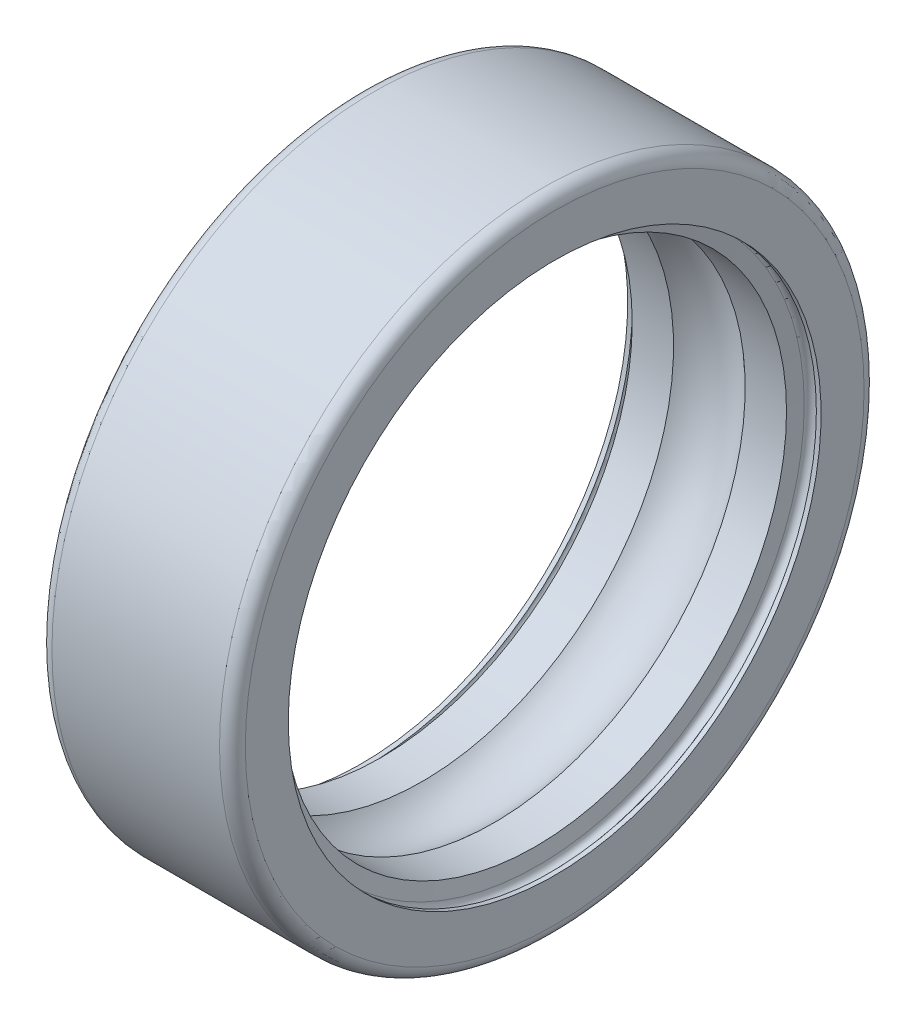
ISO-10303-21;
HEADER;
FILE_DESCRIPTION(('STEP AP214'),'2;1');
FILE_NAME('part.step','',(''),(''),'','','');
FILE_SCHEMA(('AUTOMOTIVE_DESIGN { 1 0 10303 214 1 1 1 1 }'));
ENDSEC;
DATA;
#1=APPLICATION_CONTEXT('core data for automotive mechanical design processes');
#2=APPLICATION_PROTOCOL_DEFINITION('international standard','automotive_design',2000,#1);
#3=PRODUCT_CONTEXT('',#1,'mechanical');
#4=PRODUCT('Part','Part','',(#3));
#5=PRODUCT_RELATED_PRODUCT_CATEGORY('part','',(#4));
#6=PRODUCT_DEFINITION_FORMATION('','',#4);
#7=PRODUCT_DEFINITION_CONTEXT('part definition',#1,'design');
#8=PRODUCT_DEFINITION('design','',#6,#7);
#9=PRODUCT_DEFINITION_SHAPE('','',#8);
#10=(LENGTH_UNIT() NAMED_UNIT(*) SI_UNIT(.MILLI.,.METRE.));
#11=(NAMED_UNIT(*) PLANE_ANGLE_UNIT() SI_UNIT($,.RADIAN.));
#12=(NAMED_UNIT(*) SI_UNIT($,.STERADIAN.) SOLID_ANGLE_UNIT());
#13=UNCERTAINTY_MEASURE_WITH_UNIT(LENGTH_MEASURE(1.E-05),#10,'distance_accuracy_value','');
#14=(GEOMETRIC_REPRESENTATION_CONTEXT(3) GLOBAL_UNCERTAINTY_ASSIGNED_CONTEXT((#13)) GLOBAL_UNIT_ASSIGNED_CONTEXT((#10,
#11,#12)) REPRESENTATION_CONTEXT('',''));
#15=CARTESIAN_POINT('',(0.,0.,0.));
#16=DIRECTION('',(0.,0.,1.));
#17=DIRECTION('',(1.,0.,0.));
#18=AXIS2_PLACEMENT_3D('',#15,#16,#17);
#19=CARTESIAN_POINT('',(4.5,0.,0.));
#20=DIRECTION('',(1.,0.,0.));
#21=DIRECTION('',(0.,0.,-1.));
#22=AXIS2_PLACEMENT_3D('',#19,#20,#21);
#23=TOROIDAL_SURFACE('',#22,10.,2.381);
#24=CARTESIAN_POINT('',(6.16708158168699,0.,0.));
#25=DIRECTION('',(-1.,0.,0.));
#26=DIRECTION('',(0.,0.,1.));
#27=AXIS2_PLACEMENT_3D('',#24,#25,#26);
#28=CIRCLE('',#27,11.7);
#29=CARTESIAN_POINT('',(6.16708158168699,0.,11.7));
#30=VERTEX_POINT('',#29);
#31=EDGE_CURVE('E124',#30,#30,#28,.F.);
#32=ORIENTED_EDGE('',*,*,#31,.T.);
#33=EDGE_LOOP('',(#32));
#34=FACE_BOUND('',#33,.T.);
#35=CARTESIAN_POINT('',(2.83291841831301,0.,0.));
#36=DIRECTION('',(-1.,0.,0.));
#37=DIRECTION('',(0.,0.,1.));
#38=AXIS2_PLACEMENT_3D('',#35,#36,#37);
#39=CIRCLE('',#38,11.7);
#40=CARTESIAN_POINT('',(2.83291841831301,0.,11.7));
#41=VERTEX_POINT('',#40);
#42=EDGE_CURVE('E129',#41,#41,#39,.T.);
#43=ORIENTED_EDGE('',*,*,#42,.T.);
#44=EDGE_LOOP('',(#43));
#45=FACE_BOUND('',#44,.T.);
#46=ADVANCED_FACE('F15',(#34,#45),#23,.F.);
#47=CARTESIAN_POINT('',(8.4,0.,0.));
#48=DIRECTION('',(-1.,0.,0.));
#49=DIRECTION('',(0.,0.,1.));
#50=AXIS2_PLACEMENT_3D('',#47,#48,#49);
#51=CYLINDRICAL_SURFACE('',#50,11.7);
#52=CARTESIAN_POINT('',(0.909428886495922,0.,0.));
#53=DIRECTION('',(-1.,0.,0.));
#54=DIRECTION('',(0.,0.,1.));
#55=AXIS2_PLACEMENT_3D('',#52,#53,#54);
#56=CIRCLE('',#55,11.7);
#57=CARTESIAN_POINT('',(0.909428886495922,0.,11.7));
#58=VERTEX_POINT('',#57);
#59=EDGE_CURVE('E119',#58,#58,#56,.T.);
#60=ORIENTED_EDGE('',*,*,#59,.T.);
#61=EDGE_LOOP('',(#60));
#62=FACE_BOUND('',#61,.T.);
#63=ORIENTED_EDGE('',*,*,#42,.F.);
#64=EDGE_LOOP('',(#63));
#65=FACE_BOUND('',#64,.T.);
#66=ADVANCED_FACE('F243',(#62,#65),#51,.F.);
#67=CARTESIAN_POINT('',(8.4,0.,0.));
#68=DIRECTION('',(-1.,0.,0.));
#69=DIRECTION('',(0.,0.,1.));
#70=AXIS2_PLACEMENT_3D('',#67,#68,#69);
#71=CYLINDRICAL_SURFACE('',#70,11.7);
#72=ORIENTED_EDGE('',*,*,#31,.F.);
#73=EDGE_LOOP('',(#72));
#74=FACE_BOUND('',#73,.T.);
#75=CARTESIAN_POINT('',(8.09057111350408,0.,0.));
#76=DIRECTION('',(1.,0.,0.));
#77=DIRECTION('',(0.,0.,-1.));
#78=AXIS2_PLACEMENT_3D('',#75,#76,#77);
#79=CIRCLE('',#78,11.7);
#80=CARTESIAN_POINT('',(8.09057111350408,0.,-11.7));
#81=VERTEX_POINT('',#80);
#82=EDGE_CURVE('E114',#81,#81,#79,.T.);
#83=ORIENTED_EDGE('',*,*,#82,.T.);
#84=EDGE_LOOP('',(#83));
#85=FACE_BOUND('',#84,.T.);
#86=ADVANCED_FACE('F233',(#74,#85),#71,.F.);
#87=CARTESIAN_POINT('',(0.786000000000001,0.,0.));
#88=DIRECTION('',(-1.,0.,0.));
#89=DIRECTION('',(0.,-1.,0.));
#90=AXIS2_PLACEMENT_3D('',#87,#88,#89);
#91=CONICAL_SURFACE('',#90,12.4,1.39626340159547);
#92=CARTESIAN_POINT('',(0.786000000000001,0.,0.));
#93=DIRECTION('',(1.,0.,0.));
#94=DIRECTION('',(0.,0.,-1.));
#95=AXIS2_PLACEMENT_3D('',#92,#93,#94);
#96=CIRCLE('',#95,12.4);
#97=CARTESIAN_POINT('',(0.786000000000001,0.,-12.4));
#98=VERTEX_POINT('',#97);
#99=EDGE_CURVE('E108',#98,#98,#96,.F.);
#100=ORIENTED_EDGE('',*,*,#99,.T.);
#101=EDGE_LOOP('',(#100));
#102=FACE_BOUND('',#101,.T.);
#103=ORIENTED_EDGE('',*,*,#59,.F.);
#104=EDGE_LOOP('',(#103));
#105=FACE_BOUND('',#104,.T.);
#106=ADVANCED_FACE('F167',(#102,#105),#91,.F.);
#107=CARTESIAN_POINT('',(8.21400000000001,0.,0.));
#108=DIRECTION('',(1.,0.,0.));
#109=DIRECTION('',(0.,0.,-1.));
#110=AXIS2_PLACEMENT_3D('',#107,#108,#109);
#111=CONICAL_SURFACE('',#110,12.4,1.39626340159546);
#112=ORIENTED_EDGE('',*,*,#82,.F.);
#113=EDGE_LOOP('',(#112));
#114=FACE_BOUND('',#113,.T.);
#115=CARTESIAN_POINT('',(8.214,0.,0.));
#116=DIRECTION('',(1.,0.,0.));
#117=DIRECTION('',(0.,0.,-1.));
#118=AXIS2_PLACEMENT_3D('',#115,#116,#117);
#119=CIRCLE('',#118,12.4);
#120=CARTESIAN_POINT('',(8.214,0.,-12.4));
#121=VERTEX_POINT('',#120);
#122=EDGE_CURVE('E104',#121,#121,#119,.T.);
#123=ORIENTED_EDGE('',*,*,#122,.T.);
#124=EDGE_LOOP('',(#123));
#125=FACE_BOUND('',#124,.T.);
#126=ADVANCED_FACE('F161',(#114,#125),#111,.F.);
#127=CARTESIAN_POINT('',(0.503000000000001,0.,0.));
#128=DIRECTION('',(1.,0.,0.));
#129=DIRECTION('',(0.,0.,-1.));
#130=AXIS2_PLACEMENT_3D('',#127,#128,#129);
#131=TOROIDAL_SURFACE('',#130,12.4,0.283);
#132=ORIENTED_EDGE('',*,*,#99,.F.);
#133=EDGE_LOOP('',(#132));
#134=FACE_BOUND('',#133,.T.);
#135=CARTESIAN_POINT('',(0.22,0.,0.));
#136=DIRECTION('',(-1.,0.,0.));
#137=DIRECTION('',(0.,0.,1.));
#138=AXIS2_PLACEMENT_3D('',#135,#136,#137);
#139=CIRCLE('',#138,12.4);
#140=CARTESIAN_POINT('',(0.22,0.,12.4));
#141=VERTEX_POINT('',#140);
#142=EDGE_CURVE('E107',#141,#141,#139,.T.);
#143=ORIENTED_EDGE('',*,*,#142,.T.);
#144=EDGE_LOOP('',(#143));
#145=FACE_BOUND('',#144,.T.);
#146=ADVANCED_FACE('F95',(#134,#145),#131,.F.);
#147=CARTESIAN_POINT('',(8.497,0.,0.));
#148=DIRECTION('',(1.,0.,0.));
#149=DIRECTION('',(0.,0.,-1.));
#150=AXIS2_PLACEMENT_3D('',#147,#148,#149);
#151=TOROIDAL_SURFACE('',#150,12.40000001666,0.282999999999999);
#152=CARTESIAN_POINT('',(8.7799999999996,0.,0.));
#153=DIRECTION('',(-1.,0.,0.));
#154=DIRECTION('',(0.,0.,1.));
#155=AXIS2_PLACEMENT_3D('',#152,#153,#154);
#156=CIRCLE('',#155,12.40000024686);
#157=CARTESIAN_POINT('',(8.7799999999996,0.,12.40000024686));
#158=VERTEX_POINT('',#157);
#159=EDGE_CURVE('E141',#158,#158,#156,.F.);
#160=ORIENTED_EDGE('',*,*,#159,.T.);
#161=EDGE_LOOP('',(#160));
#162=FACE_BOUND('',#161,.T.);
#163=ORIENTED_EDGE('',*,*,#122,.F.);
#164=EDGE_LOOP('',(#163));
#165=FACE_BOUND('',#164,.T.);
#166=ADVANCED_FACE('F90',(#162,#165),#151,.F.);
#167=CARTESIAN_POINT('',(8.4,0.,0.));
#168=DIRECTION('',(-1.,0.,0.));
#169=DIRECTION('',(0.,0.,1.));
#170=AXIS2_PLACEMENT_3D('',#167,#168,#169);
#171=CYLINDRICAL_SURFACE('',#170,12.4);
#172=CARTESIAN_POINT('',(0.,0.,0.));
#173=DIRECTION('',(-1.,0.,0.));
#174=DIRECTION('',(0.,0.,1.));
#175=AXIS2_PLACEMENT_3D('',#172,#173,#174);
#176=CIRCLE('',#175,12.4);
#177=CARTESIAN_POINT('',(0.,0.,12.4));
#178=VERTEX_POINT('',#177);
#179=EDGE_CURVE('E19',#178,#178,#176,.F.);
#180=ORIENTED_EDGE('',*,*,#179,.F.);
#181=EDGE_LOOP('',(#180));
#182=FACE_BOUND('',#181,.T.);
#183=ORIENTED_EDGE('',*,*,#142,.F.);
#184=EDGE_LOOP('',(#183));
#185=FACE_BOUND('',#184,.T.);
#186=ADVANCED_FACE('F86',(#182,#185),#171,.F.);
#187=CARTESIAN_POINT('',(8.4,0.,0.));
#188=DIRECTION('',(-1.,0.,0.));
#189=DIRECTION('',(0.,0.,1.));
#190=AXIS2_PLACEMENT_3D('',#187,#188,#189);
#191=CYLINDRICAL_SURFACE('',#190,12.40000024686);
#192=ORIENTED_EDGE('',*,*,#159,.F.);
#193=EDGE_LOOP('',(#192));
#194=FACE_BOUND('',#193,.T.);
#195=CARTESIAN_POINT('',(9.,0.,0.));
#196=DIRECTION('',(-1.,0.,0.));
#197=DIRECTION('',(0.,0.,1.));
#198=AXIS2_PLACEMENT_3D('',#195,#196,#197);
#199=CIRCLE('',#198,12.40000024686);
#200=CARTESIAN_POINT('',(9.,0.,12.40000024686));
#201=VERTEX_POINT('',#200);
#202=EDGE_CURVE('E136',#201,#201,#199,.T.);
#203=ORIENTED_EDGE('',*,*,#202,.F.);
#204=EDGE_LOOP('',(#203));
#205=FACE_BOUND('',#204,.T.);
#206=ADVANCED_FACE('F82',(#194,#205),#191,.F.);
#207=CARTESIAN_POINT('',(0.,14.4,0.));
#208=DIRECTION('',(-1.,0.,0.));
#209=DIRECTION('',(0.,0.,1.));
#210=AXIS2_PLACEMENT_3D('',#207,#208,#209);
#211=PLANE('',#210);
#212=CARTESIAN_POINT('',(0.,0.,0.));
#213=DIRECTION('',(1.,0.,0.));
#214=DIRECTION('',(0.,0.,-1.));
#215=AXIS2_PLACEMENT_3D('',#212,#213,#214);
#216=CIRCLE('',#215,14.4);
#217=CARTESIAN_POINT('',(0.,0.,-14.4));
#218=VERTEX_POINT('',#217);
#219=EDGE_CURVE('E66',#218,#218,#216,.T.);
#220=ORIENTED_EDGE('',*,*,#219,.F.);
#221=EDGE_LOOP('',(#220));
#222=FACE_BOUND('',#221,.T.);
#223=ORIENTED_EDGE('',*,*,#179,.T.);
#224=EDGE_LOOP('',(#223));
#225=FACE_BOUND('',#224,.T.);
#226=ADVANCED_FACE('F72',(#222,#225),#211,.T.);
#227=CARTESIAN_POINT('',(9.,12.4,0.));
#228=DIRECTION('',(1.,0.,0.));
#229=DIRECTION('',(0.,0.,-1.));
#230=AXIS2_PLACEMENT_3D('',#227,#228,#229);
#231=PLANE('',#230);
#232=ORIENTED_EDGE('',*,*,#202,.T.);
#233=EDGE_LOOP('',(#232));
#234=FACE_BOUND('',#233,.T.);
#235=CARTESIAN_POINT('',(9.,0.,0.));
#236=DIRECTION('',(-1.,0.,0.));
#237=DIRECTION('',(0.,0.,-1.));
#238=AXIS2_PLACEMENT_3D('',#235,#236,#237);
#239=CIRCLE('',#238,14.4);
#240=CARTESIAN_POINT('',(9.,0.,-14.4));
#241=VERTEX_POINT('',#240);
#242=EDGE_CURVE('E28',#241,#241,#239,.T.);
#243=ORIENTED_EDGE('',*,*,#242,.F.);
#244=EDGE_LOOP('',(#243));
#245=FACE_BOUND('',#244,.T.);
#246=ADVANCED_FACE('F81',(#234,#245),#231,.T.);
#247=CARTESIAN_POINT('',(0.600000000000001,0.,0.));
#248=DIRECTION('',(1.,0.,0.));
#249=DIRECTION('',(0.,0.,-1.));
#250=AXIS2_PLACEMENT_3D('',#247,#248,#249);
#251=TOROIDAL_SURFACE('',#250,14.4,0.6);
#252=CARTESIAN_POINT('',(0.6,0.,0.));
#253=DIRECTION('',(-1.,0.,0.));
#254=DIRECTION('',(0.,0.,1.));
#255=AXIS2_PLACEMENT_3D('',#252,#253,#254);
#256=CIRCLE('',#255,15.);
#257=CARTESIAN_POINT('',(0.6,0.,15.));
#258=VERTEX_POINT('',#257);
#259=EDGE_CURVE('E23',#258,#258,#256,.F.);
#260=ORIENTED_EDGE('',*,*,#259,.F.);
#261=EDGE_LOOP('',(#260));
#262=FACE_BOUND('',#261,.T.);
#263=ORIENTED_EDGE('',*,*,#219,.T.);
#264=EDGE_LOOP('',(#263));
#265=FACE_BOUND('',#264,.T.);
#266=ADVANCED_FACE('F46',(#262,#265),#251,.T.);
#267=CARTESIAN_POINT('',(8.4,0.,0.));
#268=DIRECTION('',(1.,0.,0.));
#269=DIRECTION('',(0.,0.,-1.));
#270=AXIS2_PLACEMENT_3D('',#267,#268,#269);
#271=TOROIDAL_SURFACE('',#270,14.4,0.599999999999998);
#272=ORIENTED_EDGE('',*,*,#242,.T.);
#273=EDGE_LOOP('',(#272));
#274=FACE_BOUND('',#273,.T.);
#275=CARTESIAN_POINT('',(8.4,0.,0.));
#276=DIRECTION('',(-1.,0.,0.));
#277=DIRECTION('',(0.,0.,1.));
#278=AXIS2_PLACEMENT_3D('',#275,#276,#277);
#279=CIRCLE('',#278,15.);
#280=CARTESIAN_POINT('',(8.4,0.,15.));
#281=VERTEX_POINT('',#280);
#282=EDGE_CURVE('E10',#281,#281,#279,.T.);
#283=ORIENTED_EDGE('',*,*,#282,.F.);
#284=EDGE_LOOP('',(#283));
#285=FACE_BOUND('',#284,.T.);
#286=ADVANCED_FACE('F40',(#274,#285),#271,.T.);
#287=CARTESIAN_POINT('',(8.4,0.,0.));
#288=DIRECTION('',(-1.,0.,0.));
#289=DIRECTION('',(0.,0.,1.));
#290=AXIS2_PLACEMENT_3D('',#287,#288,#289);
#291=CYLINDRICAL_SURFACE('',#290,15.);
#292=ORIENTED_EDGE('',*,*,#282,.T.);
#293=EDGE_LOOP('',(#292));
#294=FACE_BOUND('',#293,.T.);
#295=ORIENTED_EDGE('',*,*,#259,.T.);
#296=EDGE_LOOP('',(#295));
#297=FACE_BOUND('',#296,.T.);
#298=ADVANCED_FACE('F45',(#294,#297),#291,.T.);
#299=CLOSED_SHELL('',(#46,#66,#86,#106,#126,#146,#166,#186,#206,#226,#246,#266,#286,#298));
#300=MANIFOLD_SOLID_BREP('B1',#299);
#301=ADVANCED_BREP_SHAPE_REPRESENTATION('',(#18,#300),#14);
#302=SHAPE_DEFINITION_REPRESENTATION(#9,#301);
ENDSEC;
END-ISO-10303-21;
